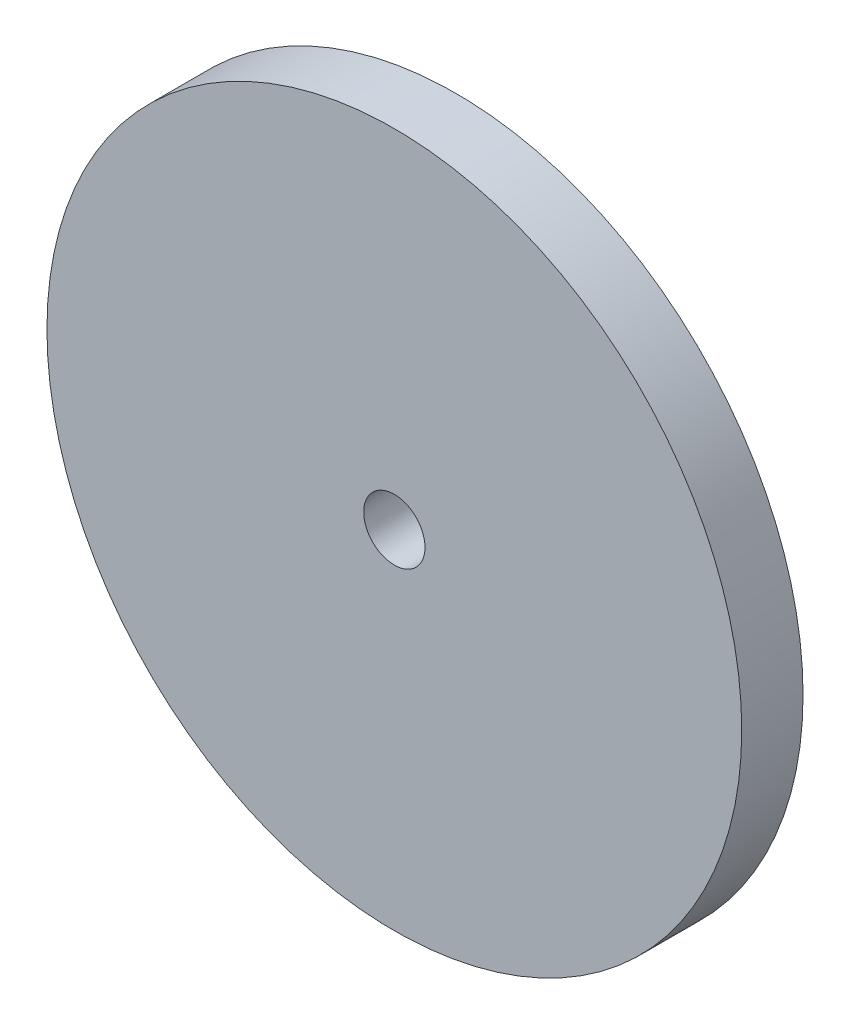
ISO-10303-21;
HEADER;
FILE_DESCRIPTION(('STEP AP214'),'2;1');
FILE_NAME('part.step','',(''),(''),'','','');
FILE_SCHEMA(('AUTOMOTIVE_DESIGN { 1 0 10303 214 1 1 1 1 }'));
ENDSEC;
DATA;
#1=APPLICATION_CONTEXT('core data for automotive mechanical design processes');
#2=APPLICATION_PROTOCOL_DEFINITION('international standard','automotive_design',2000,#1);
#3=PRODUCT_CONTEXT('',#1,'mechanical');
#4=PRODUCT('Part','Part','',(#3));
#5=PRODUCT_RELATED_PRODUCT_CATEGORY('part','',(#4));
#6=PRODUCT_DEFINITION_FORMATION('','',#4);
#7=PRODUCT_DEFINITION_CONTEXT('part definition',#1,'design');
#8=PRODUCT_DEFINITION('design','',#6,#7);
#9=PRODUCT_DEFINITION_SHAPE('','',#8);
#10=(LENGTH_UNIT() NAMED_UNIT(*) SI_UNIT(.MILLI.,.METRE.));
#11=(NAMED_UNIT(*) PLANE_ANGLE_UNIT() SI_UNIT($,.RADIAN.));
#12=(NAMED_UNIT(*) SI_UNIT($,.STERADIAN.) SOLID_ANGLE_UNIT());
#13=UNCERTAINTY_MEASURE_WITH_UNIT(LENGTH_MEASURE(1.E-05),#10,'distance_accuracy_value','');
#14=(GEOMETRIC_REPRESENTATION_CONTEXT(3) GLOBAL_UNCERTAINTY_ASSIGNED_CONTEXT((#13)) GLOBAL_UNIT_ASSIGNED_CONTEXT((#10,
#11,#12)) REPRESENTATION_CONTEXT('',''));
#15=CARTESIAN_POINT('',(0.,0.,0.));
#16=DIRECTION('',(0.,0.,1.));
#17=DIRECTION('',(1.,0.,0.));
#18=AXIS2_PLACEMENT_3D('',#15,#16,#17);
#19=CARTESIAN_POINT('',(0.,0.,3.));
#20=DIRECTION('',(0.,0.,-1.));
#21=DIRECTION('',(-1.,0.,0.));
#22=AXIS2_PLACEMENT_3D('',#19,#20,#21);
#23=CYLINDRICAL_SURFACE('',#22,17.);
#24=CARTESIAN_POINT('',(0.,0.,3.));
#25=DIRECTION('',(0.,0.,1.));
#26=DIRECTION('',(1.,0.,0.));
#27=AXIS2_PLACEMENT_3D('',#24,#25,#26);
#28=CIRCLE('',#27,17.);
#29=CARTESIAN_POINT('',(17.,0.,3.));
#30=VERTEX_POINT('',#29);
#31=EDGE_CURVE('E10',#30,#30,#28,.T.);
#32=ORIENTED_EDGE('',*,*,#31,.F.);
#33=EDGE_LOOP('',(#32));
#34=FACE_BOUND('',#33,.T.);
#35=CARTESIAN_POINT('',(0.,0.,0.));
#36=DIRECTION('',(0.,0.,1.));
#37=DIRECTION('',(1.,0.,0.));
#38=AXIS2_PLACEMENT_3D('',#35,#36,#37);
#39=CIRCLE('',#38,17.);
#40=CARTESIAN_POINT('',(17.,0.,0.));
#41=VERTEX_POINT('',#40);
#42=EDGE_CURVE('E34',#41,#41,#39,.T.);
#43=ORIENTED_EDGE('',*,*,#42,.T.);
#44=EDGE_LOOP('',(#43));
#45=FACE_BOUND('',#44,.T.);
#46=ADVANCED_FACE('F31',(#34,#45),#23,.T.);
#47=CARTESIAN_POINT('',(0.,0.,3.));
#48=DIRECTION('',(0.,0.,1.));
#49=DIRECTION('',(1.,0.,0.));
#50=AXIS2_PLACEMENT_3D('',#47,#48,#49);
#51=PLANE('',#50);
#52=CARTESIAN_POINT('',(0.,0.,3.));
#53=DIRECTION('',(0.,0.,1.));
#54=DIRECTION('',(1.,0.,0.));
#55=AXIS2_PLACEMENT_3D('',#52,#53,#54);
#56=CIRCLE('',#55,1.5);
#57=CARTESIAN_POINT('',(1.5,0.,3.));
#58=VERTEX_POINT('',#57);
#59=EDGE_CURVE('E41',#58,#58,#56,.T.);
#60=ORIENTED_EDGE('',*,*,#59,.F.);
#61=EDGE_LOOP('',(#60));
#62=FACE_BOUND('',#61,.T.);
#63=ORIENTED_EDGE('',*,*,#31,.T.);
#64=EDGE_LOOP('',(#63));
#65=FACE_BOUND('',#64,.T.);
#66=ADVANCED_FACE('F52',(#62,#65),#51,.T.);
#67=CARTESIAN_POINT('',(0.,0.,0.));
#68=DIRECTION('',(0.,0.,1.));
#69=DIRECTION('',(1.,0.,0.));
#70=AXIS2_PLACEMENT_3D('',#67,#68,#69);
#71=PLANE('',#70);
#72=CARTESIAN_POINT('',(0.,0.,0.));
#73=DIRECTION('',(0.,0.,1.));
#74=DIRECTION('',(1.,0.,0.));
#75=AXIS2_PLACEMENT_3D('',#72,#73,#74);
#76=CIRCLE('',#75,1.5);
#77=CARTESIAN_POINT('',(1.5,0.,0.));
#78=VERTEX_POINT('',#77);
#79=EDGE_CURVE('E43',#78,#78,#76,.T.);
#80=ORIENTED_EDGE('',*,*,#79,.T.);
#81=EDGE_LOOP('',(#80));
#82=FACE_BOUND('',#81,.T.);
#83=ORIENTED_EDGE('',*,*,#42,.F.);
#84=EDGE_LOOP('',(#83));
#85=FACE_BOUND('',#84,.T.);
#86=ADVANCED_FACE('F54',(#82,#85),#71,.F.);
#87=CARTESIAN_POINT('',(0.,0.,3.));
#88=DIRECTION('',(0.,0.,-1.));
#89=DIRECTION('',(-1.,0.,0.));
#90=AXIS2_PLACEMENT_3D('',#87,#88,#89);
#91=CYLINDRICAL_SURFACE('',#90,1.5);
#92=ORIENTED_EDGE('',*,*,#59,.T.);
#93=EDGE_LOOP('',(#92));
#94=FACE_BOUND('',#93,.T.);
#95=ORIENTED_EDGE('',*,*,#79,.F.);
#96=EDGE_LOOP('',(#95));
#97=FACE_BOUND('',#96,.T.);
#98=ADVANCED_FACE('F49',(#94,#97),#91,.F.);
#99=CLOSED_SHELL('',(#46,#66,#86,#98));
#100=MANIFOLD_SOLID_BREP('B2',#99);
#101=ADVANCED_BREP_SHAPE_REPRESENTATION('',(#18,#100),#14);
#102=SHAPE_DEFINITION_REPRESENTATION(#9,#101);
ENDSEC;
END-ISO-10303-21;
